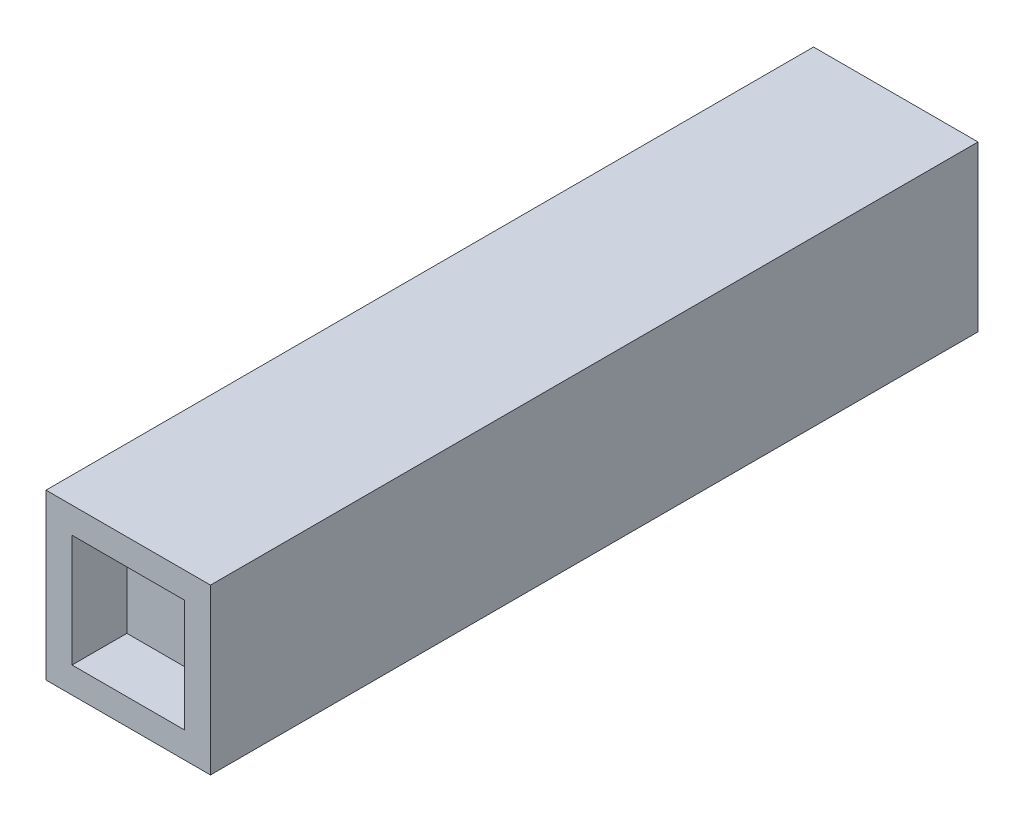
ISO-10303-21;
HEADER;
FILE_DESCRIPTION(('STEP AP214'),'2;1');
FILE_NAME('part.step','',(''),(''),'','','');
FILE_SCHEMA(('AUTOMOTIVE_DESIGN { 1 0 10303 214 1 1 1 1 }'));
ENDSEC;
DATA;
#1=APPLICATION_CONTEXT('core data for automotive mechanical design processes');
#2=APPLICATION_PROTOCOL_DEFINITION('international standard','automotive_design',2000,#1);
#3=PRODUCT_CONTEXT('',#1,'mechanical');
#4=PRODUCT('Part','Part','',(#3));
#5=PRODUCT_RELATED_PRODUCT_CATEGORY('part','',(#4));
#6=PRODUCT_DEFINITION_FORMATION('','',#4);
#7=PRODUCT_DEFINITION_CONTEXT('part definition',#1,'design');
#8=PRODUCT_DEFINITION('design','',#6,#7);
#9=PRODUCT_DEFINITION_SHAPE('','',#8);
#10=(LENGTH_UNIT() NAMED_UNIT(*) SI_UNIT(.MILLI.,.METRE.));
#11=(NAMED_UNIT(*) PLANE_ANGLE_UNIT() SI_UNIT($,.RADIAN.));
#12=(NAMED_UNIT(*) SI_UNIT($,.STERADIAN.) SOLID_ANGLE_UNIT());
#13=UNCERTAINTY_MEASURE_WITH_UNIT(LENGTH_MEASURE(1.E-05),#10,'distance_accuracy_value','');
#14=(GEOMETRIC_REPRESENTATION_CONTEXT(3) GLOBAL_UNCERTAINTY_ASSIGNED_CONTEXT((#13)) GLOBAL_UNIT_ASSIGNED_CONTEXT((#10,
#11,#12)) REPRESENTATION_CONTEXT('',''));
#15=CARTESIAN_POINT('',(0.,0.,0.));
#16=DIRECTION('',(0.,0.,1.));
#17=DIRECTION('',(1.,0.,0.));
#18=AXIS2_PLACEMENT_3D('',#15,#16,#17);
#19=CARTESIAN_POINT('',(0.,0.,0.));
#20=DIRECTION('',(0.,0.,-1.));
#21=DIRECTION('',(-1.,0.,0.));
#22=AXIS2_PLACEMENT_3D('',#19,#20,#21);
#23=PLANE('',#22);
#24=DIRECTION('',(0.,-1.,0.));
#25=VECTOR('',#24,1.);
#26=CARTESIAN_POINT('',(-15.,-15.,0.));
#27=LINE('',#26,#25);
#28=CARTESIAN_POINT('',(-15.,15.,0.));
#29=VERTEX_POINT('',#28);
#30=CARTESIAN_POINT('',(-15.,-15.,0.));
#31=VERTEX_POINT('',#30);
#32=EDGE_CURVE('E193',#29,#31,#27,.T.);
#33=ORIENTED_EDGE('',*,*,#32,.F.);
#34=DIRECTION('',(-1.,0.,0.));
#35=VECTOR('',#34,1.);
#36=CARTESIAN_POINT('',(-15.,15.,0.));
#37=LINE('',#36,#35);
#38=CARTESIAN_POINT('',(15.,15.,0.));
#39=VERTEX_POINT('',#38);
#40=EDGE_CURVE('E202',#39,#29,#37,.T.);
#41=ORIENTED_EDGE('',*,*,#40,.F.);
#42=DIRECTION('',(0.,1.,0.));
#43=VECTOR('',#42,1.);
#44=CARTESIAN_POINT('',(15.,-15.,0.));
#45=LINE('',#44,#43);
#46=CARTESIAN_POINT('',(15.,-15.,0.));
#47=VERTEX_POINT('',#46);
#48=EDGE_CURVE('E216',#47,#39,#45,.T.);
#49=ORIENTED_EDGE('',*,*,#48,.F.);
#50=DIRECTION('',(1.,0.,0.));
#51=VECTOR('',#50,1.);
#52=CARTESIAN_POINT('',(-15.,-15.,0.));
#53=LINE('',#52,#51);
#54=EDGE_CURVE('E212',#31,#47,#53,.T.);
#55=ORIENTED_EDGE('',*,*,#54,.F.);
#56=EDGE_LOOP('',(#33,#41,#49,#55));
#57=FACE_BOUND('',#56,.T.);
#58=DIRECTION('',(-1.,0.,0.));
#59=VECTOR('',#58,1.);
#60=CARTESIAN_POINT('',(-10.,10.,0.));
#61=LINE('',#60,#59);
#62=CARTESIAN_POINT('',(10.,10.,0.));
#63=VERTEX_POINT('',#62);
#64=CARTESIAN_POINT('',(-10.,10.,0.));
#65=VERTEX_POINT('',#64);
#66=EDGE_CURVE('E171',#63,#65,#61,.T.);
#67=ORIENTED_EDGE('',*,*,#66,.T.);
#68=DIRECTION('',(0.,-1.,0.));
#69=VECTOR('',#68,1.);
#70=CARTESIAN_POINT('',(-10.,-10.,0.));
#71=LINE('',#70,#69);
#72=CARTESIAN_POINT('',(-10.,-10.,0.));
#73=VERTEX_POINT('',#72);
#74=EDGE_CURVE('E67',#65,#73,#71,.T.);
#75=ORIENTED_EDGE('',*,*,#74,.T.);
#76=DIRECTION('',(1.,0.,0.));
#77=VECTOR('',#76,1.);
#78=CARTESIAN_POINT('',(-10.,-10.,0.));
#79=LINE('',#78,#77);
#80=CARTESIAN_POINT('',(10.,-10.,0.));
#81=VERTEX_POINT('',#80);
#82=EDGE_CURVE('E183',#73,#81,#79,.T.);
#83=ORIENTED_EDGE('',*,*,#82,.T.);
#84=DIRECTION('',(0.,1.,0.));
#85=VECTOR('',#84,1.);
#86=CARTESIAN_POINT('',(10.,-10.,0.));
#87=LINE('',#86,#85);
#88=EDGE_CURVE('E189',#81,#63,#87,.T.);
#89=ORIENTED_EDGE('',*,*,#88,.T.);
#90=EDGE_LOOP('',(#67,#75,#83,#89));
#91=FACE_BOUND('',#90,.T.);
#92=ADVANCED_FACE('F43',(#57,#91),#23,.T.);
#93=CARTESIAN_POINT('',(-15.,-15.,140.));
#94=DIRECTION('',(1.,0.,0.));
#95=DIRECTION('',(0.,0.,-1.));
#96=AXIS2_PLACEMENT_3D('',#93,#94,#95);
#97=PLANE('',#96);
#98=ORIENTED_EDGE('',*,*,#32,.T.);
#99=DIRECTION('',(0.,0.,-1.));
#100=VECTOR('',#99,1.);
#101=CARTESIAN_POINT('',(-15.,-15.,140.));
#102=LINE('',#101,#100);
#103=CARTESIAN_POINT('',(-15.,-15.,140.));
#104=VERTEX_POINT('',#103);
#105=EDGE_CURVE('E11',#104,#31,#102,.T.);
#106=ORIENTED_EDGE('',*,*,#105,.F.);
#107=DIRECTION('',(0.,-1.,0.));
#108=VECTOR('',#107,1.);
#109=CARTESIAN_POINT('',(-15.,-15.,140.));
#110=LINE('',#109,#108);
#111=CARTESIAN_POINT('',(-15.,15.,140.));
#112=VERTEX_POINT('',#111);
#113=EDGE_CURVE('E203',#112,#104,#110,.T.);
#114=ORIENTED_EDGE('',*,*,#113,.F.);
#115=DIRECTION('',(0.,0.,-1.));
#116=VECTOR('',#115,1.);
#117=CARTESIAN_POINT('',(-15.,15.,140.));
#118=LINE('',#117,#116);
#119=EDGE_CURVE('E211',#112,#29,#118,.T.);
#120=ORIENTED_EDGE('',*,*,#119,.T.);
#121=EDGE_LOOP('',(#98,#106,#114,#120));
#122=FACE_BOUND('',#121,.T.);
#123=ADVANCED_FACE('F44',(#122),#97,.F.);
#124=CARTESIAN_POINT('',(-15.,-15.,140.));
#125=DIRECTION('',(0.,1.,0.));
#126=DIRECTION('',(0.,0.,1.));
#127=AXIS2_PLACEMENT_3D('',#124,#125,#126);
#128=PLANE('',#127);
#129=ORIENTED_EDGE('',*,*,#54,.T.);
#130=DIRECTION('',(0.,0.,-1.));
#131=VECTOR('',#130,1.);
#132=CARTESIAN_POINT('',(15.,-15.,140.));
#133=LINE('',#132,#131);
#134=CARTESIAN_POINT('',(15.,-15.,140.));
#135=VERTEX_POINT('',#134);
#136=EDGE_CURVE('E51',#135,#47,#133,.T.);
#137=ORIENTED_EDGE('',*,*,#136,.F.);
#138=DIRECTION('',(1.,0.,0.));
#139=VECTOR('',#138,1.);
#140=CARTESIAN_POINT('',(-15.,-15.,140.));
#141=LINE('',#140,#139);
#142=EDGE_CURVE('E204',#104,#135,#141,.T.);
#143=ORIENTED_EDGE('',*,*,#142,.F.);
#144=ORIENTED_EDGE('',*,*,#105,.T.);
#145=EDGE_LOOP('',(#129,#137,#143,#144));
#146=FACE_BOUND('',#145,.T.);
#147=ADVANCED_FACE('F241',(#146),#128,.F.);
#148=CARTESIAN_POINT('',(15.,-15.,140.));
#149=DIRECTION('',(-1.,0.,0.));
#150=DIRECTION('',(0.,0.,1.));
#151=AXIS2_PLACEMENT_3D('',#148,#149,#150);
#152=PLANE('',#151);
#153=ORIENTED_EDGE('',*,*,#48,.T.);
#154=DIRECTION('',(0.,0.,-1.));
#155=VECTOR('',#154,1.);
#156=CARTESIAN_POINT('',(15.,15.,140.));
#157=LINE('',#156,#155);
#158=CARTESIAN_POINT('',(15.,15.,140.));
#159=VERTEX_POINT('',#158);
#160=EDGE_CURVE('E222',#159,#39,#157,.T.);
#161=ORIENTED_EDGE('',*,*,#160,.F.);
#162=DIRECTION('',(0.,1.,0.));
#163=VECTOR('',#162,1.);
#164=CARTESIAN_POINT('',(15.,-15.,140.));
#165=LINE('',#164,#163);
#166=EDGE_CURVE('E210',#135,#159,#165,.T.);
#167=ORIENTED_EDGE('',*,*,#166,.F.);
#168=ORIENTED_EDGE('',*,*,#136,.T.);
#169=EDGE_LOOP('',(#153,#161,#167,#168));
#170=FACE_BOUND('',#169,.T.);
#171=ADVANCED_FACE('F229',(#170),#152,.F.);
#172=CARTESIAN_POINT('',(-15.,15.,140.));
#173=DIRECTION('',(0.,-1.,0.));
#174=DIRECTION('',(0.,0.,-1.));
#175=AXIS2_PLACEMENT_3D('',#172,#173,#174);
#176=PLANE('',#175);
#177=ORIENTED_EDGE('',*,*,#40,.T.);
#178=ORIENTED_EDGE('',*,*,#119,.F.);
#179=DIRECTION('',(-1.,0.,0.));
#180=VECTOR('',#179,1.);
#181=CARTESIAN_POINT('',(-15.,15.,140.));
#182=LINE('',#181,#180);
#183=EDGE_CURVE('E207',#159,#112,#182,.T.);
#184=ORIENTED_EDGE('',*,*,#183,.F.);
#185=ORIENTED_EDGE('',*,*,#160,.T.);
#186=EDGE_LOOP('',(#177,#178,#184,#185));
#187=FACE_BOUND('',#186,.T.);
#188=ADVANCED_FACE('F240',(#187),#176,.F.);
#189=CARTESIAN_POINT('',(0.,0.,140.));
#190=DIRECTION('',(0.,0.,-1.));
#191=DIRECTION('',(-1.,0.,0.));
#192=AXIS2_PLACEMENT_3D('',#189,#190,#191);
#193=PLANE('',#192);
#194=DIRECTION('',(1.,0.,0.));
#195=VECTOR('',#194,1.);
#196=CARTESIAN_POINT('',(-10.25,-10.25,140.));
#197=LINE('',#196,#195);
#198=CARTESIAN_POINT('',(-10.25,-10.25,140.));
#199=VERTEX_POINT('',#198);
#200=CARTESIAN_POINT('',(10.25,-10.25,140.));
#201=VERTEX_POINT('',#200);
#202=EDGE_CURVE('E161',#199,#201,#197,.T.);
#203=ORIENTED_EDGE('',*,*,#202,.F.);
#204=DIRECTION('',(0.,-1.,0.));
#205=VECTOR('',#204,1.);
#206=CARTESIAN_POINT('',(-10.25,-10.25,140.));
#207=LINE('',#206,#205);
#208=CARTESIAN_POINT('',(-10.25,10.25,140.));
#209=VERTEX_POINT('',#208);
#210=EDGE_CURVE('E59',#209,#199,#207,.T.);
#211=ORIENTED_EDGE('',*,*,#210,.F.);
#212=DIRECTION('',(-1.,0.,0.));
#213=VECTOR('',#212,1.);
#214=CARTESIAN_POINT('',(-10.25,10.25,140.));
#215=LINE('',#214,#213);
#216=CARTESIAN_POINT('',(10.25,10.25,140.));
#217=VERTEX_POINT('',#216);
#218=EDGE_CURVE('E155',#217,#209,#215,.T.);
#219=ORIENTED_EDGE('',*,*,#218,.F.);
#220=DIRECTION('',(0.,1.,0.));
#221=VECTOR('',#220,1.);
#222=CARTESIAN_POINT('',(10.25,-10.25,140.));
#223=LINE('',#222,#221);
#224=EDGE_CURVE('E154',#201,#217,#223,.T.);
#225=ORIENTED_EDGE('',*,*,#224,.F.);
#226=EDGE_LOOP('',(#203,#211,#219,#225));
#227=FACE_BOUND('',#226,.T.);
#228=ORIENTED_EDGE('',*,*,#113,.T.);
#229=ORIENTED_EDGE('',*,*,#142,.T.);
#230=ORIENTED_EDGE('',*,*,#166,.T.);
#231=ORIENTED_EDGE('',*,*,#183,.T.);
#232=EDGE_LOOP('',(#228,#229,#230,#231));
#233=FACE_BOUND('',#232,.T.);
#234=ADVANCED_FACE('F244',(#227,#233),#193,.F.);
#235=CARTESIAN_POINT('',(-10.,-10.,-5.));
#236=DIRECTION('',(-1.,0.,0.));
#237=DIRECTION('',(0.,0.,1.));
#238=AXIS2_PLACEMENT_3D('',#235,#236,#237);
#239=PLANE('',#238);
#240=ORIENTED_EDGE('',*,*,#74,.F.);
#241=DIRECTION('',(0.,0.,1.));
#242=VECTOR('',#241,1.);
#243=CARTESIAN_POINT('',(-10.,10.,-5.));
#244=LINE('',#243,#242);
#245=CARTESIAN_POINT('',(-10.,10.,-5.));
#246=VERTEX_POINT('',#245);
#247=EDGE_CURVE('E194',#246,#65,#244,.T.);
#248=ORIENTED_EDGE('',*,*,#247,.F.);
#249=DIRECTION('',(0.,-1.,0.));
#250=VECTOR('',#249,1.);
#251=CARTESIAN_POINT('',(-10.,-10.,-5.));
#252=LINE('',#251,#250);
#253=CARTESIAN_POINT('',(-10.,-10.,-5.));
#254=VERTEX_POINT('',#253);
#255=EDGE_CURVE('E168',#246,#254,#252,.T.);
#256=ORIENTED_EDGE('',*,*,#255,.T.);
#257=DIRECTION('',(0.,0.,1.));
#258=VECTOR('',#257,1.);
#259=CARTESIAN_POINT('',(-10.,-10.,-5.));
#260=LINE('',#259,#258);
#261=EDGE_CURVE('E181',#254,#73,#260,.T.);
#262=ORIENTED_EDGE('',*,*,#261,.T.);
#263=EDGE_LOOP('',(#240,#248,#256,#262));
#264=FACE_BOUND('',#263,.T.);
#265=ADVANCED_FACE('F263',(#264),#239,.T.);
#266=CARTESIAN_POINT('',(-10.,10.,-5.));
#267=DIRECTION('',(0.,1.,0.));
#268=DIRECTION('',(0.,0.,1.));
#269=AXIS2_PLACEMENT_3D('',#266,#267,#268);
#270=PLANE('',#269);
#271=ORIENTED_EDGE('',*,*,#66,.F.);
#272=DIRECTION('',(0.,0.,1.));
#273=VECTOR('',#272,1.);
#274=CARTESIAN_POINT('',(10.,10.,-5.));
#275=LINE('',#274,#273);
#276=CARTESIAN_POINT('',(10.,10.,-5.));
#277=VERTEX_POINT('',#276);
#278=EDGE_CURVE('E198',#277,#63,#275,.T.);
#279=ORIENTED_EDGE('',*,*,#278,.F.);
#280=DIRECTION('',(-1.,0.,0.));
#281=VECTOR('',#280,1.);
#282=CARTESIAN_POINT('',(-10.,10.,-5.));
#283=LINE('',#282,#281);
#284=EDGE_CURVE('E178',#277,#246,#283,.T.);
#285=ORIENTED_EDGE('',*,*,#284,.T.);
#286=ORIENTED_EDGE('',*,*,#247,.T.);
#287=EDGE_LOOP('',(#271,#279,#285,#286));
#288=FACE_BOUND('',#287,.T.);
#289=ADVANCED_FACE('F267',(#288),#270,.T.);
#290=CARTESIAN_POINT('',(10.,-10.,-5.));
#291=DIRECTION('',(1.,0.,0.));
#292=DIRECTION('',(0.,0.,-1.));
#293=AXIS2_PLACEMENT_3D('',#290,#291,#292);
#294=PLANE('',#293);
#295=ORIENTED_EDGE('',*,*,#88,.F.);
#296=DIRECTION('',(0.,0.,1.));
#297=VECTOR('',#296,1.);
#298=CARTESIAN_POINT('',(10.,-10.,-5.));
#299=LINE('',#298,#297);
#300=CARTESIAN_POINT('',(10.,-10.,-5.));
#301=VERTEX_POINT('',#300);
#302=EDGE_CURVE('E196',#301,#81,#299,.T.);
#303=ORIENTED_EDGE('',*,*,#302,.F.);
#304=DIRECTION('',(0.,1.,0.));
#305=VECTOR('',#304,1.);
#306=CARTESIAN_POINT('',(10.,-10.,-5.));
#307=LINE('',#306,#305);
#308=EDGE_CURVE('E180',#301,#277,#307,.T.);
#309=ORIENTED_EDGE('',*,*,#308,.T.);
#310=ORIENTED_EDGE('',*,*,#278,.T.);
#311=EDGE_LOOP('',(#295,#303,#309,#310));
#312=FACE_BOUND('',#311,.T.);
#313=ADVANCED_FACE('F291',(#312),#294,.T.);
#314=CARTESIAN_POINT('',(-10.,-10.,-5.));
#315=DIRECTION('',(0.,-1.,0.));
#316=DIRECTION('',(0.,0.,-1.));
#317=AXIS2_PLACEMENT_3D('',#314,#315,#316);
#318=PLANE('',#317);
#319=ORIENTED_EDGE('',*,*,#82,.F.);
#320=ORIENTED_EDGE('',*,*,#261,.F.);
#321=DIRECTION('',(1.,0.,0.));
#322=VECTOR('',#321,1.);
#323=CARTESIAN_POINT('',(-10.,-10.,-5.));
#324=LINE('',#323,#322);
#325=EDGE_CURVE('E174',#254,#301,#324,.T.);
#326=ORIENTED_EDGE('',*,*,#325,.T.);
#327=ORIENTED_EDGE('',*,*,#302,.T.);
#328=EDGE_LOOP('',(#319,#320,#326,#327));
#329=FACE_BOUND('',#328,.T.);
#330=ADVANCED_FACE('F286',(#329),#318,.T.);
#331=CARTESIAN_POINT('',(0.,0.,-5.));
#332=DIRECTION('',(0.,0.,-1.));
#333=DIRECTION('',(-1.,0.,0.));
#334=AXIS2_PLACEMENT_3D('',#331,#332,#333);
#335=PLANE('',#334);
#336=ORIENTED_EDGE('',*,*,#255,.F.);
#337=ORIENTED_EDGE('',*,*,#284,.F.);
#338=ORIENTED_EDGE('',*,*,#308,.F.);
#339=ORIENTED_EDGE('',*,*,#325,.F.);
#340=EDGE_LOOP('',(#336,#337,#338,#339));
#341=FACE_BOUND('',#340,.T.);
#342=ADVANCED_FACE('F285',(#341),#335,.T.);
#343=CARTESIAN_POINT('',(-10.25,-10.25,130.));
#344=DIRECTION('',(-1.,0.,0.));
#345=DIRECTION('',(0.,0.,1.));
#346=AXIS2_PLACEMENT_3D('',#343,#344,#345);
#347=PLANE('',#346);
#348=ORIENTED_EDGE('',*,*,#210,.T.);
#349=DIRECTION('',(0.,0.,1.));
#350=VECTOR('',#349,1.);
#351=CARTESIAN_POINT('',(-10.25,-10.25,130.));
#352=LINE('',#351,#350);
#353=CARTESIAN_POINT('',(-10.25,-10.25,130.));
#354=VERTEX_POINT('',#353);
#355=EDGE_CURVE('E128',#354,#199,#352,.T.);
#356=ORIENTED_EDGE('',*,*,#355,.F.);
#357=DIRECTION('',(0.,-1.,0.));
#358=VECTOR('',#357,1.);
#359=CARTESIAN_POINT('',(-10.25,-10.25,130.));
#360=LINE('',#359,#358);
#361=CARTESIAN_POINT('',(-10.25,10.25,130.));
#362=VERTEX_POINT('',#361);
#363=EDGE_CURVE('E131',#362,#354,#360,.T.);
#364=ORIENTED_EDGE('',*,*,#363,.F.);
#365=DIRECTION('',(0.,0.,1.));
#366=VECTOR('',#365,1.);
#367=CARTESIAN_POINT('',(-10.25,10.25,130.));
#368=LINE('',#367,#366);
#369=EDGE_CURVE('E164',#362,#209,#368,.T.);
#370=ORIENTED_EDGE('',*,*,#369,.T.);
#371=EDGE_LOOP('',(#348,#356,#364,#370));
#372=FACE_BOUND('',#371,.T.);
#373=ADVANCED_FACE('F135',(#372),#347,.F.);
#374=CARTESIAN_POINT('',(-10.25,10.25,130.));
#375=DIRECTION('',(0.,1.,0.));
#376=DIRECTION('',(0.,0.,1.));
#377=AXIS2_PLACEMENT_3D('',#374,#375,#376);
#378=PLANE('',#377);
#379=ORIENTED_EDGE('',*,*,#218,.T.);
#380=ORIENTED_EDGE('',*,*,#369,.F.);
#381=DIRECTION('',(-1.,0.,0.));
#382=VECTOR('',#381,1.);
#383=CARTESIAN_POINT('',(-10.25,10.25,130.));
#384=LINE('',#383,#382);
#385=CARTESIAN_POINT('',(10.25,10.25,130.));
#386=VERTEX_POINT('',#385);
#387=EDGE_CURVE('E138',#386,#362,#384,.T.);
#388=ORIENTED_EDGE('',*,*,#387,.F.);
#389=DIRECTION('',(0.,0.,1.));
#390=VECTOR('',#389,1.);
#391=CARTESIAN_POINT('',(10.25,10.25,130.));
#392=LINE('',#391,#390);
#393=EDGE_CURVE('E170',#386,#217,#392,.T.);
#394=ORIENTED_EDGE('',*,*,#393,.T.);
#395=EDGE_LOOP('',(#379,#380,#388,#394));
#396=FACE_BOUND('',#395,.T.);
#397=ADVANCED_FACE('F274',(#396),#378,.F.);
#398=CARTESIAN_POINT('',(10.25,-10.25,130.));
#399=DIRECTION('',(1.,0.,0.));
#400=DIRECTION('',(0.,0.,-1.));
#401=AXIS2_PLACEMENT_3D('',#398,#399,#400);
#402=PLANE('',#401);
#403=ORIENTED_EDGE('',*,*,#224,.T.);
#404=ORIENTED_EDGE('',*,*,#393,.F.);
#405=DIRECTION('',(0.,1.,0.));
#406=VECTOR('',#405,1.);
#407=CARTESIAN_POINT('',(10.25,-10.25,130.));
#408=LINE('',#407,#406);
#409=CARTESIAN_POINT('',(10.25,-10.25,130.));
#410=VERTEX_POINT('',#409);
#411=EDGE_CURVE('E146',#410,#386,#408,.T.);
#412=ORIENTED_EDGE('',*,*,#411,.F.);
#413=DIRECTION('',(0.,0.,1.));
#414=VECTOR('',#413,1.);
#415=CARTESIAN_POINT('',(10.25,-10.25,130.));
#416=LINE('',#415,#414);
#417=EDGE_CURVE('E136',#410,#201,#416,.T.);
#418=ORIENTED_EDGE('',*,*,#417,.T.);
#419=EDGE_LOOP('',(#403,#404,#412,#418));
#420=FACE_BOUND('',#419,.T.);
#421=ADVANCED_FACE('F272',(#420),#402,.F.);
#422=CARTESIAN_POINT('',(-10.25,-10.25,130.));
#423=DIRECTION('',(0.,-1.,0.));
#424=DIRECTION('',(0.,0.,-1.));
#425=AXIS2_PLACEMENT_3D('',#422,#423,#424);
#426=PLANE('',#425);
#427=ORIENTED_EDGE('',*,*,#202,.T.);
#428=ORIENTED_EDGE('',*,*,#417,.F.);
#429=DIRECTION('',(1.,0.,0.));
#430=VECTOR('',#429,1.);
#431=CARTESIAN_POINT('',(-10.25,-10.25,130.));
#432=LINE('',#431,#430);
#433=EDGE_CURVE('E141',#354,#410,#432,.T.);
#434=ORIENTED_EDGE('',*,*,#433,.F.);
#435=ORIENTED_EDGE('',*,*,#355,.T.);
#436=EDGE_LOOP('',(#427,#428,#434,#435));
#437=FACE_BOUND('',#436,.T.);
#438=ADVANCED_FACE('F145',(#437),#426,.F.);
#439=CARTESIAN_POINT('',(0.,0.,130.));
#440=DIRECTION('',(0.,0.,-1.));
#441=DIRECTION('',(-1.,0.,0.));
#442=AXIS2_PLACEMENT_3D('',#439,#440,#441);
#443=PLANE('',#442);
#444=ORIENTED_EDGE('',*,*,#363,.T.);
#445=ORIENTED_EDGE('',*,*,#433,.T.);
#446=ORIENTED_EDGE('',*,*,#411,.T.);
#447=ORIENTED_EDGE('',*,*,#387,.T.);
#448=EDGE_LOOP('',(#444,#445,#446,#447));
#449=FACE_BOUND('',#448,.T.);
#450=ADVANCED_FACE('F147',(#449),#443,.F.);
#451=CLOSED_SHELL('',(#92,#123,#147,#171,#188,#234,#265,#289,#313,#330,#342,#373,#397,#421,#438,#450));
#452=MANIFOLD_SOLID_BREP('B2',#451);
#453=ADVANCED_BREP_SHAPE_REPRESENTATION('',(#18,#452),#14);
#454=SHAPE_DEFINITION_REPRESENTATION(#9,#453);
ENDSEC;
END-ISO-10303-21;
